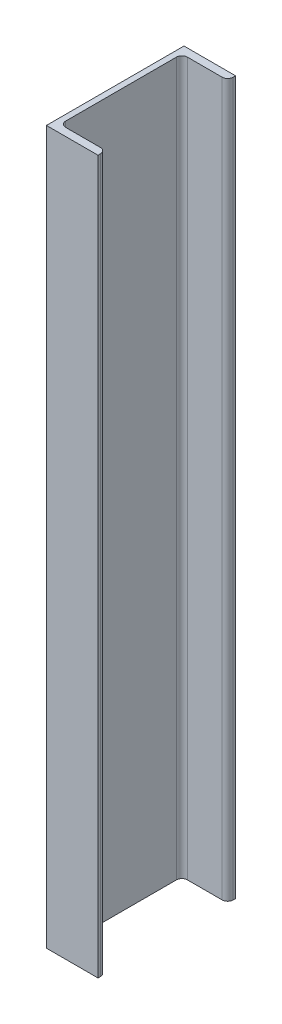
ISO-10303-21;
HEADER;
FILE_DESCRIPTION(('STEP AP214'),'2;1');
FILE_NAME('part.step','',(''),(''),'','','');
FILE_SCHEMA(('AUTOMOTIVE_DESIGN { 1 0 10303 214 1 1 1 1 }'));
ENDSEC;
DATA;
#1=APPLICATION_CONTEXT('core data for automotive mechanical design processes');
#2=APPLICATION_PROTOCOL_DEFINITION('international standard','automotive_design',2000,#1);
#3=PRODUCT_CONTEXT('',#1,'mechanical');
#4=PRODUCT('Part','Part','',(#3));
#5=PRODUCT_RELATED_PRODUCT_CATEGORY('part','',(#4));
#6=PRODUCT_DEFINITION_FORMATION('','',#4);
#7=PRODUCT_DEFINITION_CONTEXT('part definition',#1,'design');
#8=PRODUCT_DEFINITION('design','',#6,#7);
#9=PRODUCT_DEFINITION_SHAPE('','',#8);
#10=(LENGTH_UNIT() NAMED_UNIT(*) SI_UNIT(.MILLI.,.METRE.));
#11=(NAMED_UNIT(*) PLANE_ANGLE_UNIT() SI_UNIT($,.RADIAN.));
#12=(NAMED_UNIT(*) SI_UNIT($,.STERADIAN.) SOLID_ANGLE_UNIT());
#13=UNCERTAINTY_MEASURE_WITH_UNIT(LENGTH_MEASURE(1.E-05),#10,'distance_accuracy_value','');
#14=(GEOMETRIC_REPRESENTATION_CONTEXT(3) GLOBAL_UNCERTAINTY_ASSIGNED_CONTEXT((#13)) GLOBAL_UNIT_ASSIGNED_CONTEXT((#10,
#11,#12)) REPRESENTATION_CONTEXT('',''));
#15=CARTESIAN_POINT('',(0.,0.,0.));
#16=DIRECTION('',(0.,0.,1.));
#17=DIRECTION('',(1.,0.,0.));
#18=AXIS2_PLACEMENT_3D('',#15,#16,#17);
#19=CARTESIAN_POINT('',(-38.4426229508197,1036.,-80.9836065573771));
#20=DIRECTION('',(-1.,0.,0.));
#21=DIRECTION('',(0.,0.,1.));
#22=AXIS2_PLACEMENT_3D('',#19,#20,#21);
#23=PLANE('',#22);
#24=DIRECTION('',(0.,0.,-1.));
#25=VECTOR('',#24,1.);
#26=CARTESIAN_POINT('',(-38.4426229508197,0.,-80.9836065573771));
#27=LINE('',#26,#25);
#28=CARTESIAN_POINT('',(-38.4426229508197,0.,-77.4836065573772));
#29=VERTEX_POINT('',#28);
#30=CARTESIAN_POINT('',(-38.4426229508197,0.,-80.9836065573771));
#31=VERTEX_POINT('',#30);
#32=EDGE_CURVE('E153',#29,#31,#27,.T.);
#33=ORIENTED_EDGE('',*,*,#32,.T.);
#34=DIRECTION('',(0.,-1.,0.));
#35=VECTOR('',#34,1.);
#36=CARTESIAN_POINT('',(-38.4426229508197,1036.,-80.9836065573771));
#37=LINE('',#36,#35);
#38=CARTESIAN_POINT('',(-38.4426229508197,1036.,-80.9836065573771));
#39=VERTEX_POINT('',#38);
#40=EDGE_CURVE('E11',#39,#31,#37,.T.);
#41=ORIENTED_EDGE('',*,*,#40,.F.);
#42=DIRECTION('',(0.,0.,-1.));
#43=VECTOR('',#42,1.);
#44=CARTESIAN_POINT('',(-38.4426229508197,1036.,-80.9836065573771));
#45=LINE('',#44,#43);
#46=CARTESIAN_POINT('',(-38.4426229508197,1036.,-77.4836065573772));
#47=VERTEX_POINT('',#46);
#48=EDGE_CURVE('E175',#47,#39,#45,.T.);
#49=ORIENTED_EDGE('',*,*,#48,.F.);
#50=DIRECTION('',(0.,-1.,0.));
#51=VECTOR('',#50,1.);
#52=CARTESIAN_POINT('',(-38.4426229508197,1036.,-77.4836065573772));
#53=LINE('',#52,#51);
#54=EDGE_CURVE('E149',#47,#29,#53,.T.);
#55=ORIENTED_EDGE('',*,*,#54,.T.);
#56=EDGE_LOOP('',(#33,#41,#49,#55));
#57=FACE_BOUND('',#56,.T.);
#58=ADVANCED_FACE('F33',(#57),#23,.F.);
#59=CARTESIAN_POINT('',(-38.4426229508197,1036.,-80.9836065573771));
#60=DIRECTION('',(0.,0.,1.));
#61=DIRECTION('',(1.,0.,0.));
#62=AXIS2_PLACEMENT_3D('',#59,#60,#61);
#63=PLANE('',#62);
#64=DIRECTION('',(-1.,0.,0.));
#65=VECTOR('',#64,1.);
#66=CARTESIAN_POINT('',(-38.4426229508197,0.,-80.9836065573771));
#67=LINE('',#66,#65);
#68=CARTESIAN_POINT('',(-113.44262295082,0.,-80.983606557377));
#69=VERTEX_POINT('',#68);
#70=EDGE_CURVE('E156',#31,#69,#67,.T.);
#71=ORIENTED_EDGE('',*,*,#70,.T.);
#72=DIRECTION('',(0.,-1.,0.));
#73=VECTOR('',#72,1.);
#74=CARTESIAN_POINT('',(-113.44262295082,1036.,-80.983606557377));
#75=LINE('',#74,#73);
#76=CARTESIAN_POINT('',(-113.44262295082,1036.,-80.983606557377));
#77=VERTEX_POINT('',#76);
#78=EDGE_CURVE('E41',#77,#69,#75,.T.);
#79=ORIENTED_EDGE('',*,*,#78,.F.);
#80=DIRECTION('',(-1.,0.,0.));
#81=VECTOR('',#80,1.);
#82=CARTESIAN_POINT('',(-38.4426229508197,1036.,-80.9836065573771));
#83=LINE('',#82,#81);
#84=EDGE_CURVE('E104',#39,#77,#83,.T.);
#85=ORIENTED_EDGE('',*,*,#84,.F.);
#86=ORIENTED_EDGE('',*,*,#40,.T.);
#87=EDGE_LOOP('',(#71,#79,#85,#86));
#88=FACE_BOUND('',#87,.T.);
#89=ADVANCED_FACE('F253',(#88),#63,.F.);
#90=CARTESIAN_POINT('',(-113.44262295082,1036.,-80.983606557377));
#91=DIRECTION('',(1.,0.,0.));
#92=DIRECTION('',(0.,0.,-1.));
#93=AXIS2_PLACEMENT_3D('',#90,#91,#92);
#94=PLANE('',#93);
#95=DIRECTION('',(0.,0.,1.));
#96=VECTOR('',#95,1.);
#97=CARTESIAN_POINT('',(-113.44262295082,0.,-80.983606557377));
#98=LINE('',#97,#96);
#99=CARTESIAN_POINT('',(-113.44262295082,0.,119.016393442623));
#100=VERTEX_POINT('',#99);
#101=EDGE_CURVE('E158',#69,#100,#98,.T.);
#102=ORIENTED_EDGE('',*,*,#101,.T.);
#103=DIRECTION('',(0.,-1.,0.));
#104=VECTOR('',#103,1.);
#105=CARTESIAN_POINT('',(-113.44262295082,1036.,119.016393442623));
#106=LINE('',#105,#104);
#107=CARTESIAN_POINT('',(-113.44262295082,1036.,119.016393442623));
#108=VERTEX_POINT('',#107);
#109=EDGE_CURVE('E194',#108,#100,#106,.T.);
#110=ORIENTED_EDGE('',*,*,#109,.F.);
#111=DIRECTION('',(0.,0.,1.));
#112=VECTOR('',#111,1.);
#113=CARTESIAN_POINT('',(-113.44262295082,1036.,-80.983606557377));
#114=LINE('',#113,#112);
#115=EDGE_CURVE('E202',#77,#108,#114,.T.);
#116=ORIENTED_EDGE('',*,*,#115,.F.);
#117=ORIENTED_EDGE('',*,*,#78,.T.);
#118=EDGE_LOOP('',(#102,#110,#116,#117));
#119=FACE_BOUND('',#118,.T.);
#120=ADVANCED_FACE('F200',(#119),#94,.F.);
#121=CARTESIAN_POINT('',(-113.44262295082,1036.,119.016393442623));
#122=DIRECTION('',(0.,0.,-1.));
#123=DIRECTION('',(-1.,0.,0.));
#124=AXIS2_PLACEMENT_3D('',#121,#122,#123);
#125=PLANE('',#124);
#126=DIRECTION('',(1.,0.,0.));
#127=VECTOR('',#126,1.);
#128=CARTESIAN_POINT('',(-113.44262295082,0.,119.016393442623));
#129=LINE('',#128,#127);
#130=CARTESIAN_POINT('',(-38.4426229508197,0.,119.016393442623));
#131=VERTEX_POINT('',#130);
#132=EDGE_CURVE('E160',#100,#131,#129,.T.);
#133=ORIENTED_EDGE('',*,*,#132,.T.);
#134=DIRECTION('',(0.,-1.,0.));
#135=VECTOR('',#134,1.);
#136=CARTESIAN_POINT('',(-38.4426229508197,1036.,119.016393442623));
#137=LINE('',#136,#135);
#138=CARTESIAN_POINT('',(-38.4426229508197,1036.,119.016393442623));
#139=VERTEX_POINT('',#138);
#140=EDGE_CURVE('E191',#139,#131,#137,.T.);
#141=ORIENTED_EDGE('',*,*,#140,.F.);
#142=DIRECTION('',(1.,0.,0.));
#143=VECTOR('',#142,1.);
#144=CARTESIAN_POINT('',(-113.44262295082,1036.,119.016393442623));
#145=LINE('',#144,#143);
#146=EDGE_CURVE('E220',#108,#139,#145,.T.);
#147=ORIENTED_EDGE('',*,*,#146,.F.);
#148=ORIENTED_EDGE('',*,*,#109,.T.);
#149=EDGE_LOOP('',(#133,#141,#147,#148));
#150=FACE_BOUND('',#149,.T.);
#151=ADVANCED_FACE('F211',(#150),#125,.F.);
#152=CARTESIAN_POINT('',(-38.4426229508197,1036.,119.016393442623));
#153=DIRECTION('',(-1.,0.,0.));
#154=DIRECTION('',(0.,0.,1.));
#155=AXIS2_PLACEMENT_3D('',#152,#153,#154);
#156=PLANE('',#155);
#157=DIRECTION('',(0.,0.,-1.));
#158=VECTOR('',#157,1.);
#159=CARTESIAN_POINT('',(-38.4426229508197,0.,119.016393442623));
#160=LINE('',#159,#158);
#161=CARTESIAN_POINT('',(-38.4426229508197,0.,115.516393442623));
#162=VERTEX_POINT('',#161);
#163=EDGE_CURVE('E162',#131,#162,#160,.T.);
#164=ORIENTED_EDGE('',*,*,#163,.T.);
#165=DIRECTION('',(0.,-1.,0.));
#166=VECTOR('',#165,1.);
#167=CARTESIAN_POINT('',(-38.4426229508197,1036.,115.516393442623));
#168=LINE('',#167,#166);
#169=CARTESIAN_POINT('',(-38.4426229508197,1036.,115.516393442623));
#170=VERTEX_POINT('',#169);
#171=EDGE_CURVE('E188',#170,#162,#168,.T.);
#172=ORIENTED_EDGE('',*,*,#171,.F.);
#173=DIRECTION('',(0.,0.,-1.));
#174=VECTOR('',#173,1.);
#175=CARTESIAN_POINT('',(-38.4426229508197,1036.,119.016393442623));
#176=LINE('',#175,#174);
#177=EDGE_CURVE('E217',#139,#170,#176,.T.);
#178=ORIENTED_EDGE('',*,*,#177,.F.);
#179=ORIENTED_EDGE('',*,*,#140,.T.);
#180=EDGE_LOOP('',(#164,#172,#178,#179));
#181=FACE_BOUND('',#180,.T.);
#182=ADVANCED_FACE('F215',(#181),#156,.F.);
#183=CARTESIAN_POINT('',(-46.4426229508197,1036.,115.516393442623));
#184=DIRECTION('',(0.,-1.,0.));
#185=DIRECTION('',(0.,0.,-1.));
#186=AXIS2_PLACEMENT_3D('',#183,#184,#185);
#187=CYLINDRICAL_SURFACE('',#186,8.);
#188=CARTESIAN_POINT('',(-46.4426229508197,0.,115.516393442623));
#189=DIRECTION('',(0.,1.,0.));
#190=DIRECTION('',(0.,0.,1.));
#191=AXIS2_PLACEMENT_3D('',#188,#189,#190);
#192=CIRCLE('',#191,8.);
#193=CARTESIAN_POINT('',(-46.4426229508198,0.,107.516393442623));
#194=VERTEX_POINT('',#193);
#195=EDGE_CURVE('E164',#162,#194,#192,.T.);
#196=ORIENTED_EDGE('',*,*,#195,.T.);
#197=DIRECTION('',(0.,-1.,0.));
#198=VECTOR('',#197,1.);
#199=CARTESIAN_POINT('',(-46.4426229508198,1036.,107.516393442623));
#200=LINE('',#199,#198);
#201=CARTESIAN_POINT('',(-46.4426229508198,1036.,107.516393442623));
#202=VERTEX_POINT('',#201);
#203=EDGE_CURVE('E185',#202,#194,#200,.T.);
#204=ORIENTED_EDGE('',*,*,#203,.F.);
#205=CARTESIAN_POINT('',(-46.4426229508197,1036.,115.516393442623));
#206=DIRECTION('',(0.,1.,0.));
#207=DIRECTION('',(0.,0.,1.));
#208=AXIS2_PLACEMENT_3D('',#205,#206,#207);
#209=CIRCLE('',#208,8.);
#210=EDGE_CURVE('E219',#170,#202,#209,.T.);
#211=ORIENTED_EDGE('',*,*,#210,.F.);
#212=ORIENTED_EDGE('',*,*,#171,.T.);
#213=EDGE_LOOP('',(#196,#204,#211,#212));
#214=FACE_BOUND('',#213,.T.);
#215=ADVANCED_FACE('F266',(#214),#187,.T.);
#216=CARTESIAN_POINT('',(-46.4426229508198,1036.,107.516393442623));
#217=DIRECTION('',(0.,0.,1.));
#218=DIRECTION('',(1.,0.,0.));
#219=AXIS2_PLACEMENT_3D('',#216,#217,#218);
#220=PLANE('',#219);
#221=DIRECTION('',(-1.,0.,0.));
#222=VECTOR('',#221,1.);
#223=CARTESIAN_POINT('',(-46.4426229508198,0.,107.516393442623));
#224=LINE('',#223,#222);
#225=CARTESIAN_POINT('',(-96.9426229508196,0.,107.516393442623));
#226=VERTEX_POINT('',#225);
#227=EDGE_CURVE('E166',#194,#226,#224,.T.);
#228=ORIENTED_EDGE('',*,*,#227,.T.);
#229=DIRECTION('',(0.,-1.,0.));
#230=VECTOR('',#229,1.);
#231=CARTESIAN_POINT('',(-96.9426229508196,1036.,107.516393442623));
#232=LINE('',#231,#230);
#233=CARTESIAN_POINT('',(-96.9426229508196,1036.,107.516393442623));
#234=VERTEX_POINT('',#233);
#235=EDGE_CURVE('E182',#234,#226,#232,.T.);
#236=ORIENTED_EDGE('',*,*,#235,.F.);
#237=DIRECTION('',(-1.,0.,0.));
#238=VECTOR('',#237,1.);
#239=CARTESIAN_POINT('',(-46.4426229508198,1036.,107.516393442623));
#240=LINE('',#239,#238);
#241=EDGE_CURVE('E222',#202,#234,#240,.T.);
#242=ORIENTED_EDGE('',*,*,#241,.F.);
#243=ORIENTED_EDGE('',*,*,#203,.T.);
#244=EDGE_LOOP('',(#228,#236,#242,#243));
#245=FACE_BOUND('',#244,.T.);
#246=ADVANCED_FACE('F269',(#245),#220,.F.);
#247=CARTESIAN_POINT('',(-96.9426229508197,1036.,99.516393442623));
#248=DIRECTION('',(0.,-1.,0.));
#249=DIRECTION('',(0.,0.,-1.));
#250=AXIS2_PLACEMENT_3D('',#247,#248,#249);
#251=CYLINDRICAL_SURFACE('',#250,8.00000000000001);
#252=CARTESIAN_POINT('',(-96.9426229508197,0.,99.516393442623));
#253=DIRECTION('',(0.,-1.,0.));
#254=DIRECTION('',(0.,0.,-1.));
#255=AXIS2_PLACEMENT_3D('',#252,#253,#254);
#256=CIRCLE('',#255,8.00000000000001);
#257=CARTESIAN_POINT('',(-104.94262295082,0.,99.5163934426229));
#258=VERTEX_POINT('',#257);
#259=EDGE_CURVE('E168',#226,#258,#256,.T.);
#260=ORIENTED_EDGE('',*,*,#259,.T.);
#261=DIRECTION('',(0.,-1.,0.));
#262=VECTOR('',#261,1.);
#263=CARTESIAN_POINT('',(-104.94262295082,1036.,99.5163934426229));
#264=LINE('',#263,#262);
#265=CARTESIAN_POINT('',(-104.94262295082,1036.,99.5163934426229));
#266=VERTEX_POINT('',#265);
#267=EDGE_CURVE('E179',#266,#258,#264,.T.);
#268=ORIENTED_EDGE('',*,*,#267,.F.);
#269=CARTESIAN_POINT('',(-96.9426229508197,1036.,99.516393442623));
#270=DIRECTION('',(0.,-1.,0.));
#271=DIRECTION('',(0.,0.,-1.));
#272=AXIS2_PLACEMENT_3D('',#269,#270,#271);
#273=CIRCLE('',#272,8.00000000000001);
#274=EDGE_CURVE('E228',#234,#266,#273,.T.);
#275=ORIENTED_EDGE('',*,*,#274,.F.);
#276=ORIENTED_EDGE('',*,*,#235,.T.);
#277=EDGE_LOOP('',(#260,#268,#275,#276));
#278=FACE_BOUND('',#277,.T.);
#279=ADVANCED_FACE('F234',(#278),#251,.F.);
#280=CARTESIAN_POINT('',(-104.94262295082,1036.,99.5163934426229));
#281=DIRECTION('',(-1.,0.,0.));
#282=DIRECTION('',(0.,0.,1.));
#283=AXIS2_PLACEMENT_3D('',#280,#281,#282);
#284=PLANE('',#283);
#285=DIRECTION('',(0.,0.,-1.));
#286=VECTOR('',#285,1.);
#287=CARTESIAN_POINT('',(-104.94262295082,0.,99.5163934426229));
#288=LINE('',#287,#286);
#289=CARTESIAN_POINT('',(-104.94262295082,0.,-61.483606557377));
#290=VERTEX_POINT('',#289);
#291=EDGE_CURVE('E170',#258,#290,#288,.T.);
#292=ORIENTED_EDGE('',*,*,#291,.T.);
#293=DIRECTION('',(0.,-1.,0.));
#294=VECTOR('',#293,1.);
#295=CARTESIAN_POINT('',(-104.94262295082,1036.,-61.483606557377));
#296=LINE('',#295,#294);
#297=CARTESIAN_POINT('',(-104.94262295082,1036.,-61.483606557377));
#298=VERTEX_POINT('',#297);
#299=EDGE_CURVE('E144',#298,#290,#296,.T.);
#300=ORIENTED_EDGE('',*,*,#299,.F.);
#301=DIRECTION('',(0.,0.,-1.));
#302=VECTOR('',#301,1.);
#303=CARTESIAN_POINT('',(-104.94262295082,1036.,99.5163934426229));
#304=LINE('',#303,#302);
#305=EDGE_CURVE('E135',#266,#298,#304,.T.);
#306=ORIENTED_EDGE('',*,*,#305,.F.);
#307=ORIENTED_EDGE('',*,*,#267,.T.);
#308=EDGE_LOOP('',(#292,#300,#306,#307));
#309=FACE_BOUND('',#308,.T.);
#310=ADVANCED_FACE('F238',(#309),#284,.F.);
#311=CARTESIAN_POINT('',(-96.9426229508197,1036.,-61.4836065573771));
#312=DIRECTION('',(0.,-1.,0.));
#313=DIRECTION('',(0.,0.,-1.));
#314=AXIS2_PLACEMENT_3D('',#311,#312,#313);
#315=CYLINDRICAL_SURFACE('',#314,8.);
#316=CARTESIAN_POINT('',(-96.9426229508197,0.,-61.4836065573771));
#317=DIRECTION('',(0.,-1.,0.));
#318=DIRECTION('',(0.,0.,-1.));
#319=AXIS2_PLACEMENT_3D('',#316,#317,#318);
#320=CIRCLE('',#319,8.);
#321=CARTESIAN_POINT('',(-96.9426229508197,0.,-69.4836065573771));
#322=VERTEX_POINT('',#321);
#323=EDGE_CURVE('E143',#290,#322,#320,.T.);
#324=ORIENTED_EDGE('',*,*,#323,.T.);
#325=DIRECTION('',(0.,-1.,0.));
#326=VECTOR('',#325,1.);
#327=CARTESIAN_POINT('',(-96.9426229508197,1036.,-69.4836065573771));
#328=LINE('',#327,#326);
#329=CARTESIAN_POINT('',(-96.9426229508197,1036.,-69.4836065573771));
#330=VERTEX_POINT('',#329);
#331=EDGE_CURVE('E140',#330,#322,#328,.T.);
#332=ORIENTED_EDGE('',*,*,#331,.F.);
#333=CARTESIAN_POINT('',(-96.9426229508197,1036.,-61.4836065573771));
#334=DIRECTION('',(0.,-1.,0.));
#335=DIRECTION('',(0.,0.,-1.));
#336=AXIS2_PLACEMENT_3D('',#333,#334,#335);
#337=CIRCLE('',#336,8.);
#338=EDGE_CURVE('E129',#298,#330,#337,.T.);
#339=ORIENTED_EDGE('',*,*,#338,.F.);
#340=ORIENTED_EDGE('',*,*,#299,.T.);
#341=EDGE_LOOP('',(#324,#332,#339,#340));
#342=FACE_BOUND('',#341,.T.);
#343=ADVANCED_FACE('F141',(#342),#315,.F.);
#344=CARTESIAN_POINT('',(-96.9426229508196,1036.,-69.4836065573771));
#345=DIRECTION('',(0.,0.,-1.));
#346=DIRECTION('',(-1.,0.,0.));
#347=AXIS2_PLACEMENT_3D('',#344,#345,#346);
#348=PLANE('',#347);
#349=DIRECTION('',(1.,0.,0.));
#350=VECTOR('',#349,1.);
#351=CARTESIAN_POINT('',(-96.9426229508196,0.,-69.4836065573771));
#352=LINE('',#351,#350);
#353=CARTESIAN_POINT('',(-46.4426229508198,0.,-69.4836065573771));
#354=VERTEX_POINT('',#353);
#355=EDGE_CURVE('E90',#322,#354,#352,.T.);
#356=ORIENTED_EDGE('',*,*,#355,.T.);
#357=DIRECTION('',(0.,-1.,0.));
#358=VECTOR('',#357,1.);
#359=CARTESIAN_POINT('',(-46.4426229508198,1036.,-69.4836065573771));
#360=LINE('',#359,#358);
#361=CARTESIAN_POINT('',(-46.4426229508198,1036.,-69.4836065573771));
#362=VERTEX_POINT('',#361);
#363=EDGE_CURVE('E145',#362,#354,#360,.T.);
#364=ORIENTED_EDGE('',*,*,#363,.F.);
#365=DIRECTION('',(1.,0.,0.));
#366=VECTOR('',#365,1.);
#367=CARTESIAN_POINT('',(-96.9426229508196,1036.,-69.4836065573771));
#368=LINE('',#367,#366);
#369=EDGE_CURVE('E133',#330,#362,#368,.T.);
#370=ORIENTED_EDGE('',*,*,#369,.F.);
#371=ORIENTED_EDGE('',*,*,#331,.T.);
#372=EDGE_LOOP('',(#356,#364,#370,#371));
#373=FACE_BOUND('',#372,.T.);
#374=ADVANCED_FACE('F147',(#373),#348,.F.);
#375=CARTESIAN_POINT('',(-46.4426229508197,1036.,-77.4836065573771));
#376=DIRECTION('',(0.,-1.,0.));
#377=DIRECTION('',(0.,0.,-1.));
#378=AXIS2_PLACEMENT_3D('',#375,#376,#377);
#379=CYLINDRICAL_SURFACE('',#378,8.);
#380=CARTESIAN_POINT('',(-46.4426229508197,0.,-77.4836065573771));
#381=DIRECTION('',(0.,1.,0.));
#382=DIRECTION('',(0.,0.,1.));
#383=AXIS2_PLACEMENT_3D('',#380,#381,#382);
#384=CIRCLE('',#383,8.);
#385=EDGE_CURVE('E96',#354,#29,#384,.T.);
#386=ORIENTED_EDGE('',*,*,#385,.T.);
#387=ORIENTED_EDGE('',*,*,#54,.F.);
#388=CARTESIAN_POINT('',(-46.4426229508197,1036.,-77.4836065573771));
#389=DIRECTION('',(0.,1.,0.));
#390=DIRECTION('',(0.,0.,1.));
#391=AXIS2_PLACEMENT_3D('',#388,#389,#390);
#392=CIRCLE('',#391,8.);
#393=EDGE_CURVE('E49',#362,#47,#392,.T.);
#394=ORIENTED_EDGE('',*,*,#393,.F.);
#395=ORIENTED_EDGE('',*,*,#363,.T.);
#396=EDGE_LOOP('',(#386,#387,#394,#395));
#397=FACE_BOUND('',#396,.T.);
#398=ADVANCED_FACE('F242',(#397),#379,.T.);
#399=CARTESIAN_POINT('',(-46.4426229508197,1036.,-77.4836065573771));
#400=DIRECTION('',(0.,1.,0.));
#401=DIRECTION('',(0.,0.,1.));
#402=AXIS2_PLACEMENT_3D('',#399,#400,#401);
#403=PLANE('',#402);
#404=ORIENTED_EDGE('',*,*,#48,.T.);
#405=ORIENTED_EDGE('',*,*,#84,.T.);
#406=ORIENTED_EDGE('',*,*,#115,.T.);
#407=ORIENTED_EDGE('',*,*,#146,.T.);
#408=ORIENTED_EDGE('',*,*,#177,.T.);
#409=ORIENTED_EDGE('',*,*,#210,.T.);
#410=ORIENTED_EDGE('',*,*,#241,.T.);
#411=ORIENTED_EDGE('',*,*,#274,.T.);
#412=ORIENTED_EDGE('',*,*,#305,.T.);
#413=ORIENTED_EDGE('',*,*,#338,.T.);
#414=ORIENTED_EDGE('',*,*,#369,.T.);
#415=ORIENTED_EDGE('',*,*,#393,.T.);
#416=EDGE_LOOP('',(#404,#405,#406,#407,#408,#409,#410,#411,#412,#413,#414,#415));
#417=FACE_BOUND('',#416,.T.);
#418=ADVANCED_FACE('F131',(#417),#403,.T.);
#419=CARTESIAN_POINT('',(-46.4426229508197,0.,-77.4836065573771));
#420=DIRECTION('',(0.,1.,0.));
#421=DIRECTION('',(0.,0.,1.));
#422=AXIS2_PLACEMENT_3D('',#419,#420,#421);
#423=PLANE('',#422);
#424=ORIENTED_EDGE('',*,*,#32,.F.);
#425=ORIENTED_EDGE('',*,*,#385,.F.);
#426=ORIENTED_EDGE('',*,*,#355,.F.);
#427=ORIENTED_EDGE('',*,*,#323,.F.);
#428=ORIENTED_EDGE('',*,*,#291,.F.);
#429=ORIENTED_EDGE('',*,*,#259,.F.);
#430=ORIENTED_EDGE('',*,*,#227,.F.);
#431=ORIENTED_EDGE('',*,*,#195,.F.);
#432=ORIENTED_EDGE('',*,*,#163,.F.);
#433=ORIENTED_EDGE('',*,*,#132,.F.);
#434=ORIENTED_EDGE('',*,*,#101,.F.);
#435=ORIENTED_EDGE('',*,*,#70,.F.);
#436=EDGE_LOOP('',(#424,#425,#426,#427,#428,#429,#430,#431,#432,#433,#434,#435));
#437=FACE_BOUND('',#436,.T.);
#438=ADVANCED_FACE('F206',(#437),#423,.F.);
#439=CLOSED_SHELL('',(#58,#89,#120,#151,#182,#215,#246,#279,#310,#343,#374,#398,#418,#438));
#440=MANIFOLD_SOLID_BREP('B2',#439);
#441=ADVANCED_BREP_SHAPE_REPRESENTATION('',(#18,#440),#14);
#442=SHAPE_DEFINITION_REPRESENTATION(#9,#441);
ENDSEC;
END-ISO-10303-21;
